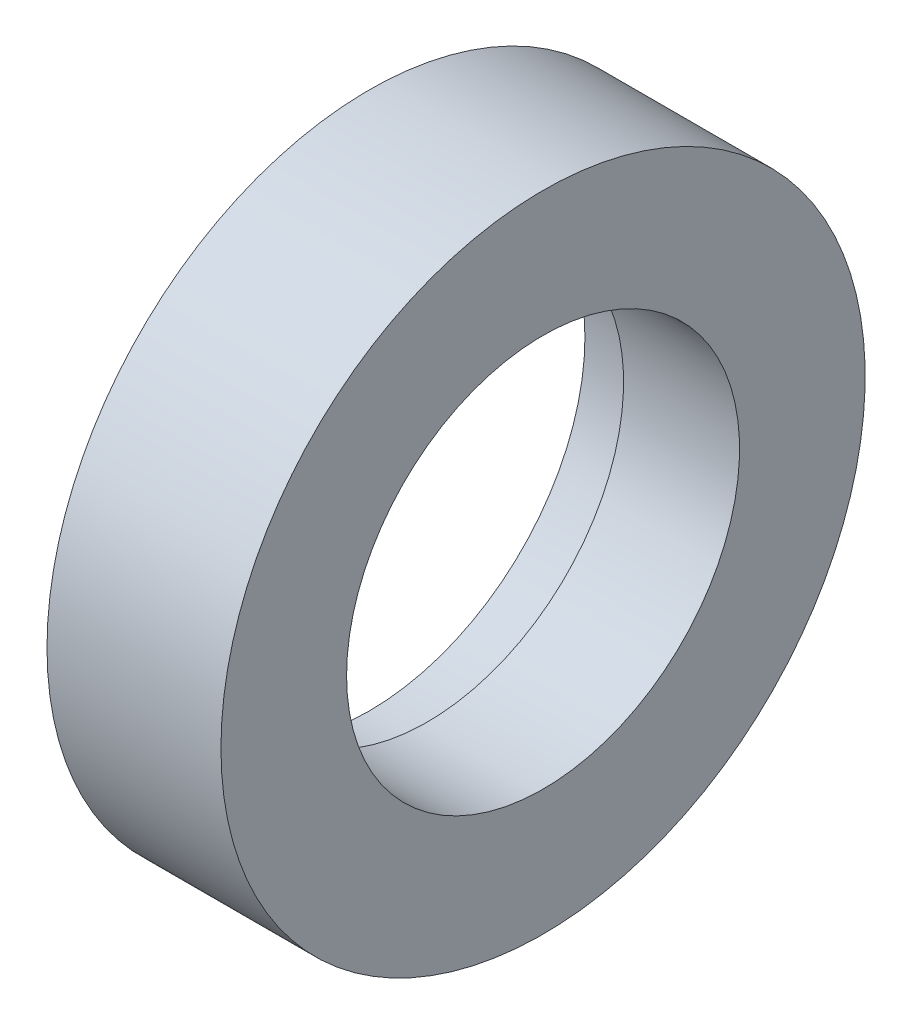
ISO-10303-21;
HEADER;
FILE_DESCRIPTION(('STEP AP214'),'2;1');
FILE_NAME('part.step','',(''),(''),'','','');
FILE_SCHEMA(('AUTOMOTIVE_DESIGN { 1 0 10303 214 1 1 1 1 }'));
ENDSEC;
DATA;
#1=APPLICATION_CONTEXT('core data for automotive mechanical design processes');
#2=APPLICATION_PROTOCOL_DEFINITION('international standard','automotive_design',2000,#1);
#3=PRODUCT_CONTEXT('',#1,'mechanical');
#4=PRODUCT('Part','Part','',(#3));
#5=PRODUCT_RELATED_PRODUCT_CATEGORY('part','',(#4));
#6=PRODUCT_DEFINITION_FORMATION('','',#4);
#7=PRODUCT_DEFINITION_CONTEXT('part definition',#1,'design');
#8=PRODUCT_DEFINITION('design','',#6,#7);
#9=PRODUCT_DEFINITION_SHAPE('','',#8);
#10=(LENGTH_UNIT() NAMED_UNIT(*) SI_UNIT(.MILLI.,.METRE.));
#11=(NAMED_UNIT(*) PLANE_ANGLE_UNIT() SI_UNIT($,.RADIAN.));
#12=(NAMED_UNIT(*) SI_UNIT($,.STERADIAN.) SOLID_ANGLE_UNIT());
#13=UNCERTAINTY_MEASURE_WITH_UNIT(LENGTH_MEASURE(1.E-05),#10,'distance_accuracy_value','');
#14=(GEOMETRIC_REPRESENTATION_CONTEXT(3) GLOBAL_UNCERTAINTY_ASSIGNED_CONTEXT((#13)) GLOBAL_UNIT_ASSIGNED_CONTEXT((#10,
#11,#12)) REPRESENTATION_CONTEXT('',''));
#15=CARTESIAN_POINT('',(0.,0.,0.));
#16=DIRECTION('',(0.,0.,1.));
#17=DIRECTION('',(1.,0.,0.));
#18=AXIS2_PLACEMENT_3D('',#15,#16,#17);
#19=CARTESIAN_POINT('',(0.,50.,0.));
#20=DIRECTION('',(1.,0.,0.));
#21=DIRECTION('',(0.,0.,-1.));
#22=AXIS2_PLACEMENT_3D('',#19,#20,#21);
#23=PLANE('',#22);
#24=CARTESIAN_POINT('',(0.,0.,0.));
#25=DIRECTION('',(-1.,0.,0.));
#26=DIRECTION('',(0.,0.,1.));
#27=AXIS2_PLACEMENT_3D('',#24,#25,#26);
#28=CIRCLE('',#27,33.5);
#29=CARTESIAN_POINT('',(0.,0.,33.5));
#30=VERTEX_POINT('',#29);
#31=EDGE_CURVE('E10',#30,#30,#28,.T.);
#32=ORIENTED_EDGE('',*,*,#31,.F.);
#33=EDGE_LOOP('',(#32));
#34=FACE_BOUND('',#33,.T.);
#35=CARTESIAN_POINT('',(0.,0.,0.));
#36=DIRECTION('',(-1.,0.,0.));
#37=DIRECTION('',(0.,0.,1.));
#38=AXIS2_PLACEMENT_3D('',#35,#36,#37);
#39=CIRCLE('',#38,50.);
#40=CARTESIAN_POINT('',(0.,0.,50.));
#41=VERTEX_POINT('',#40);
#42=EDGE_CURVE('E68',#41,#41,#39,.T.);
#43=ORIENTED_EDGE('',*,*,#42,.T.);
#44=EDGE_LOOP('',(#43));
#45=FACE_BOUND('',#44,.T.);
#46=ADVANCED_FACE('F39',(#34,#45),#23,.F.);
#47=CARTESIAN_POINT('',(0.,0.,0.));
#48=DIRECTION('',(-1.,0.,0.));
#49=DIRECTION('',(0.,0.,1.));
#50=AXIS2_PLACEMENT_3D('',#47,#48,#49);
#51=CYLINDRICAL_SURFACE('',#50,33.5);
#52=CARTESIAN_POINT('',(9.,0.,0.));
#53=DIRECTION('',(-1.,0.,0.));
#54=DIRECTION('',(0.,0.,1.));
#55=AXIS2_PLACEMENT_3D('',#52,#53,#54);
#56=CIRCLE('',#55,33.5);
#57=CARTESIAN_POINT('',(9.,0.,33.5));
#58=VERTEX_POINT('',#57);
#59=EDGE_CURVE('E46',#58,#58,#56,.T.);
#60=ORIENTED_EDGE('',*,*,#59,.F.);
#61=EDGE_LOOP('',(#60));
#62=FACE_BOUND('',#61,.T.);
#63=ORIENTED_EDGE('',*,*,#31,.T.);
#64=EDGE_LOOP('',(#63));
#65=FACE_BOUND('',#64,.T.);
#66=ADVANCED_FACE('F95',(#62,#65),#51,.F.);
#67=CARTESIAN_POINT('',(9.,33.5,0.));
#68=DIRECTION('',(1.,0.,0.));
#69=DIRECTION('',(0.,0.,-1.));
#70=AXIS2_PLACEMENT_3D('',#67,#68,#69);
#71=PLANE('',#70);
#72=CARTESIAN_POINT('',(9.,0.,0.));
#73=DIRECTION('',(-1.,0.,0.));
#74=DIRECTION('',(0.,0.,1.));
#75=AXIS2_PLACEMENT_3D('',#72,#73,#74);
#76=CIRCLE('',#75,30.5);
#77=CARTESIAN_POINT('',(9.,0.,30.5));
#78=VERTEX_POINT('',#77);
#79=EDGE_CURVE('E52',#78,#78,#76,.T.);
#80=ORIENTED_EDGE('',*,*,#79,.F.);
#81=EDGE_LOOP('',(#80));
#82=FACE_BOUND('',#81,.T.);
#83=ORIENTED_EDGE('',*,*,#59,.T.);
#84=EDGE_LOOP('',(#83));
#85=FACE_BOUND('',#84,.T.);
#86=ADVANCED_FACE('F90',(#82,#85),#71,.F.);
#87=CARTESIAN_POINT('',(0.,0.,0.));
#88=DIRECTION('',(-1.,0.,0.));
#89=DIRECTION('',(0.,0.,1.));
#90=AXIS2_PLACEMENT_3D('',#87,#88,#89);
#91=CYLINDRICAL_SURFACE('',#90,30.5);
#92=CARTESIAN_POINT('',(27.,0.,0.));
#93=DIRECTION('',(-1.,0.,0.));
#94=DIRECTION('',(0.,0.,1.));
#95=AXIS2_PLACEMENT_3D('',#92,#93,#94);
#96=CIRCLE('',#95,30.5);
#97=CARTESIAN_POINT('',(27.,0.,30.5));
#98=VERTEX_POINT('',#97);
#99=EDGE_CURVE('E58',#98,#98,#96,.T.);
#100=ORIENTED_EDGE('',*,*,#99,.F.);
#101=EDGE_LOOP('',(#100));
#102=FACE_BOUND('',#101,.T.);
#103=ORIENTED_EDGE('',*,*,#79,.T.);
#104=EDGE_LOOP('',(#103));
#105=FACE_BOUND('',#104,.T.);
#106=ADVANCED_FACE('F84',(#102,#105),#91,.F.);
#107=CARTESIAN_POINT('',(27.,30.5,0.));
#108=DIRECTION('',(-1.,0.,0.));
#109=DIRECTION('',(0.,0.,1.));
#110=AXIS2_PLACEMENT_3D('',#107,#108,#109);
#111=PLANE('',#110);
#112=CARTESIAN_POINT('',(27.,0.,0.));
#113=DIRECTION('',(-1.,0.,0.));
#114=DIRECTION('',(0.,0.,1.));
#115=AXIS2_PLACEMENT_3D('',#112,#113,#114);
#116=CIRCLE('',#115,50.);
#117=CARTESIAN_POINT('',(27.,0.,50.));
#118=VERTEX_POINT('',#117);
#119=EDGE_CURVE('E64',#118,#118,#116,.T.);
#120=ORIENTED_EDGE('',*,*,#119,.F.);
#121=EDGE_LOOP('',(#120));
#122=FACE_BOUND('',#121,.T.);
#123=ORIENTED_EDGE('',*,*,#99,.T.);
#124=EDGE_LOOP('',(#123));
#125=FACE_BOUND('',#124,.T.);
#126=ADVANCED_FACE('F78',(#122,#125),#111,.F.);
#127=CARTESIAN_POINT('',(0.,0.,0.));
#128=DIRECTION('',(-1.,0.,0.));
#129=DIRECTION('',(0.,0.,1.));
#130=AXIS2_PLACEMENT_3D('',#127,#128,#129);
#131=CYLINDRICAL_SURFACE('',#130,50.);
#132=ORIENTED_EDGE('',*,*,#42,.F.);
#133=EDGE_LOOP('',(#132));
#134=FACE_BOUND('',#133,.T.);
#135=ORIENTED_EDGE('',*,*,#119,.T.);
#136=EDGE_LOOP('',(#135));
#137=FACE_BOUND('',#136,.T.);
#138=ADVANCED_FACE('F75',(#134,#137),#131,.T.);
#139=CLOSED_SHELL('',(#46,#66,#86,#106,#126,#138));
#140=MANIFOLD_SOLID_BREP('B2',#139);
#141=ADVANCED_BREP_SHAPE_REPRESENTATION('',(#18,#140),#14);
#142=SHAPE_DEFINITION_REPRESENTATION(#9,#141);
ENDSEC;
END-ISO-10303-21;
